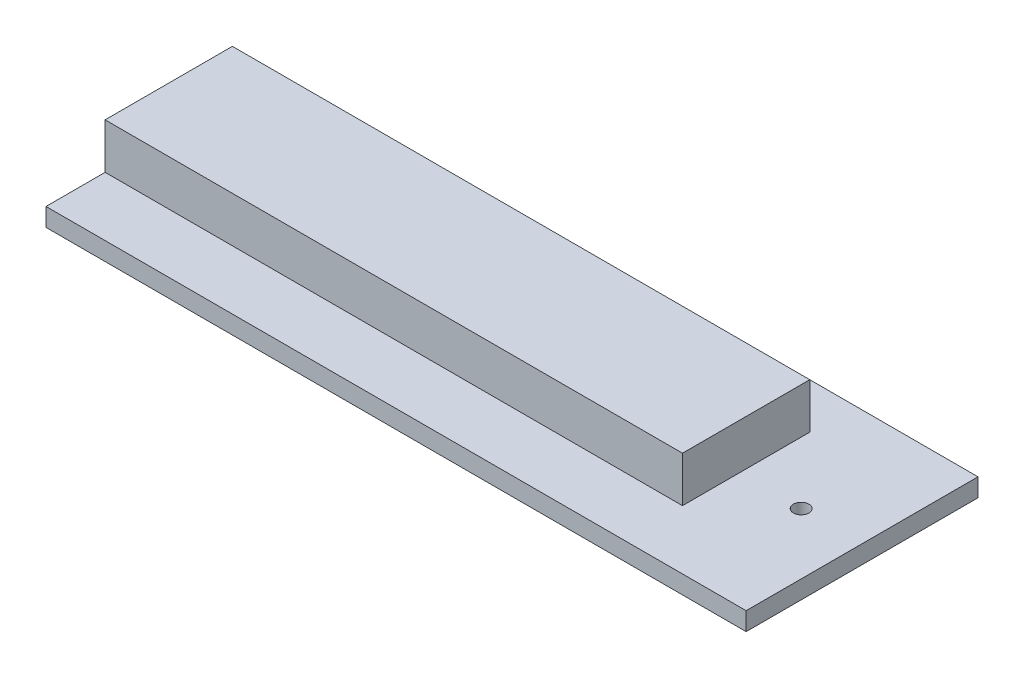
ISO-10303-21;
HEADER;
FILE_DESCRIPTION(('STEP AP214'),'2;1');
FILE_NAME('part.step','',(''),(''),'','','');
FILE_SCHEMA(('AUTOMOTIVE_DESIGN { 1 0 10303 214 1 1 1 1 }'));
ENDSEC;
DATA;
#1=APPLICATION_CONTEXT('core data for automotive mechanical design processes');
#2=APPLICATION_PROTOCOL_DEFINITION('international standard','automotive_design',2000,#1);
#3=PRODUCT_CONTEXT('',#1,'mechanical');
#4=PRODUCT('Part','Part','',(#3));
#5=PRODUCT_RELATED_PRODUCT_CATEGORY('part','',(#4));
#6=PRODUCT_DEFINITION_FORMATION('','',#4);
#7=PRODUCT_DEFINITION_CONTEXT('part definition',#1,'design');
#8=PRODUCT_DEFINITION('design','',#6,#7);
#9=PRODUCT_DEFINITION_SHAPE('','',#8);
#10=(LENGTH_UNIT() NAMED_UNIT(*) SI_UNIT(.MILLI.,.METRE.));
#11=(NAMED_UNIT(*) PLANE_ANGLE_UNIT() SI_UNIT($,.RADIAN.));
#12=(NAMED_UNIT(*) SI_UNIT($,.STERADIAN.) SOLID_ANGLE_UNIT());
#13=UNCERTAINTY_MEASURE_WITH_UNIT(LENGTH_MEASURE(1.E-05),#10,'distance_accuracy_value','');
#14=(GEOMETRIC_REPRESENTATION_CONTEXT(3) GLOBAL_UNCERTAINTY_ASSIGNED_CONTEXT((#13)) GLOBAL_UNIT_ASSIGNED_CONTEXT((#10,
#11,#12)) REPRESENTATION_CONTEXT('',''));
#15=CARTESIAN_POINT('',(0.,0.,0.));
#16=DIRECTION('',(0.,0.,1.));
#17=DIRECTION('',(1.,0.,0.));
#18=AXIS2_PLACEMENT_3D('',#15,#16,#17);
#19=CARTESIAN_POINT('',(0.,4.,0.));
#20=DIRECTION('',(0.,-1.,0.));
#21=DIRECTION('',(0.,0.,-1.));
#22=AXIS2_PLACEMENT_3D('',#19,#20,#21);
#23=PLANE('',#22);
#24=CARTESIAN_POINT('',(140.6,4.,-25.5));
#25=DIRECTION('',(0.,1.,0.));
#26=DIRECTION('',(0.,0.,-1.));
#27=AXIS2_PLACEMENT_3D('',#24,#25,#26);
#28=CIRCLE('',#27,1.70000000000001);
#29=CARTESIAN_POINT('',(140.6,4.,-27.2));
#30=VERTEX_POINT('',#29);
#31=EDGE_CURVE('E145',#30,#30,#28,.T.);
#32=ORIENTED_EDGE('',*,*,#31,.F.);
#33=EDGE_LOOP('',(#32));
#34=FACE_BOUND('',#33,.T.);
#35=DIRECTION('',(-1.,0.,0.));
#36=VECTOR('',#35,1.);
#37=CARTESIAN_POINT('',(127.,4.,-41.));
#38=LINE('',#37,#36);
#39=CARTESIAN_POINT('',(127.,4.,-41.));
#40=VERTEX_POINT('',#39);
#41=CARTESIAN_POINT('',(0.,4.,-41.));
#42=VERTEX_POINT('',#41);
#43=EDGE_CURVE('E59',#40,#42,#38,.T.);
#44=ORIENTED_EDGE('',*,*,#43,.F.);
#45=DIRECTION('',(0.,0.,-1.));
#46=VECTOR('',#45,1.);
#47=CARTESIAN_POINT('',(127.,4.,-13.));
#48=LINE('',#47,#46);
#49=CARTESIAN_POINT('',(127.,4.,-13.));
#50=VERTEX_POINT('',#49);
#51=EDGE_CURVE('E221',#50,#40,#48,.T.);
#52=ORIENTED_EDGE('',*,*,#51,.F.);
#53=DIRECTION('',(1.,0.,0.));
#54=VECTOR('',#53,1.);
#55=CARTESIAN_POINT('',(0.,4.,-13.));
#56=LINE('',#55,#54);
#57=CARTESIAN_POINT('',(0.,4.,-13.));
#58=VERTEX_POINT('',#57);
#59=EDGE_CURVE('E65',#58,#50,#56,.T.);
#60=ORIENTED_EDGE('',*,*,#59,.F.);
#61=DIRECTION('',(0.,0.,1.));
#62=VECTOR('',#61,1.);
#63=CARTESIAN_POINT('',(0.,4.,0.));
#64=LINE('',#63,#62);
#65=CARTESIAN_POINT('',(0.,4.,0.));
#66=VERTEX_POINT('',#65);
#67=EDGE_CURVE('E132',#58,#66,#64,.T.);
#68=ORIENTED_EDGE('',*,*,#67,.T.);
#69=DIRECTION('',(1.,0.,0.));
#70=VECTOR('',#69,1.);
#71=CARTESIAN_POINT('',(0.,4.,0.));
#72=LINE('',#71,#70);
#73=CARTESIAN_POINT('',(154.,4.,0.));
#74=VERTEX_POINT('',#73);
#75=EDGE_CURVE('E168',#66,#74,#72,.T.);
#76=ORIENTED_EDGE('',*,*,#75,.T.);
#77=DIRECTION('',(0.,0.,-1.));
#78=VECTOR('',#77,1.);
#79=CARTESIAN_POINT('',(154.,4.,0.));
#80=LINE('',#79,#78);
#81=CARTESIAN_POINT('',(154.,4.,-51.));
#82=VERTEX_POINT('',#81);
#83=EDGE_CURVE('E171',#74,#82,#80,.T.);
#84=ORIENTED_EDGE('',*,*,#83,.T.);
#85=DIRECTION('',(-1.,0.,0.));
#86=VECTOR('',#85,1.);
#87=CARTESIAN_POINT('',(0.,4.,-51.));
#88=LINE('',#87,#86);
#89=CARTESIAN_POINT('',(0.,4.,-51.));
#90=VERTEX_POINT('',#89);
#91=EDGE_CURVE('E174',#82,#90,#88,.T.);
#92=ORIENTED_EDGE('',*,*,#91,.T.);
#93=EDGE_CURVE('E165',#90,#42,#64,.T.);
#94=ORIENTED_EDGE('',*,*,#93,.T.);
#95=EDGE_LOOP('',(#44,#52,#60,#68,#76,#84,#92,#94));
#96=FACE_BOUND('',#95,.T.);
#97=ADVANCED_FACE('F43',(#34,#96),#23,.F.);
#98=CARTESIAN_POINT('',(0.,0.,0.));
#99=DIRECTION('',(0.,-1.,0.));
#100=DIRECTION('',(0.,0.,-1.));
#101=AXIS2_PLACEMENT_3D('',#98,#99,#100);
#102=PLANE('',#101);
#103=CARTESIAN_POINT('',(13.4,0.,-25.5));
#104=DIRECTION('',(0.,1.,0.));
#105=DIRECTION('',(0.,0.,1.));
#106=AXIS2_PLACEMENT_3D('',#103,#104,#105);
#107=CIRCLE('',#106,1.7);
#108=CARTESIAN_POINT('',(13.4,0.,-23.8));
#109=VERTEX_POINT('',#108);
#110=EDGE_CURVE('E149',#109,#109,#107,.T.);
#111=ORIENTED_EDGE('',*,*,#110,.T.);
#112=EDGE_LOOP('',(#111));
#113=FACE_BOUND('',#112,.T.);
#114=DIRECTION('',(0.,0.,1.));
#115=VECTOR('',#114,1.);
#116=CARTESIAN_POINT('',(0.,0.,0.));
#117=LINE('',#116,#115);
#118=CARTESIAN_POINT('',(0.,0.,-51.));
#119=VERTEX_POINT('',#118);
#120=CARTESIAN_POINT('',(0.,0.,0.));
#121=VERTEX_POINT('',#120);
#122=EDGE_CURVE('E164',#119,#121,#117,.T.);
#123=ORIENTED_EDGE('',*,*,#122,.F.);
#124=DIRECTION('',(-1.,0.,0.));
#125=VECTOR('',#124,1.);
#126=CARTESIAN_POINT('',(0.,0.,-51.));
#127=LINE('',#126,#125);
#128=CARTESIAN_POINT('',(154.,0.,-51.));
#129=VERTEX_POINT('',#128);
#130=EDGE_CURVE('E186',#129,#119,#127,.T.);
#131=ORIENTED_EDGE('',*,*,#130,.F.);
#132=DIRECTION('',(0.,0.,-1.));
#133=VECTOR('',#132,1.);
#134=CARTESIAN_POINT('',(154.,0.,0.));
#135=LINE('',#134,#133);
#136=CARTESIAN_POINT('',(154.,0.,0.));
#137=VERTEX_POINT('',#136);
#138=EDGE_CURVE('E183',#137,#129,#135,.T.);
#139=ORIENTED_EDGE('',*,*,#138,.F.);
#140=DIRECTION('',(1.,0.,0.));
#141=VECTOR('',#140,1.);
#142=CARTESIAN_POINT('',(0.,0.,0.));
#143=LINE('',#142,#141);
#144=EDGE_CURVE('E180',#121,#137,#143,.T.);
#145=ORIENTED_EDGE('',*,*,#144,.F.);
#146=EDGE_LOOP('',(#123,#131,#139,#145));
#147=FACE_BOUND('',#146,.T.);
#148=CARTESIAN_POINT('',(77.,0.,-25.5));
#149=DIRECTION('',(0.,1.,0.));
#150=DIRECTION('',(0.,0.,1.));
#151=AXIS2_PLACEMENT_3D('',#148,#149,#150);
#152=CIRCLE('',#151,1.7);
#153=CARTESIAN_POINT('',(77.,0.,-23.8));
#154=VERTEX_POINT('',#153);
#155=EDGE_CURVE('E157',#154,#154,#152,.T.);
#156=ORIENTED_EDGE('',*,*,#155,.T.);
#157=EDGE_LOOP('',(#156));
#158=FACE_BOUND('',#157,.T.);
#159=CARTESIAN_POINT('',(140.6,0.,-25.5));
#160=DIRECTION('',(0.,1.,0.));
#161=DIRECTION('',(0.,0.,-1.));
#162=AXIS2_PLACEMENT_3D('',#159,#160,#161);
#163=CIRCLE('',#162,1.70000000000001);
#164=CARTESIAN_POINT('',(140.6,0.,-27.2));
#165=VERTEX_POINT('',#164);
#166=EDGE_CURVE('E150',#165,#165,#163,.T.);
#167=ORIENTED_EDGE('',*,*,#166,.T.);
#168=EDGE_LOOP('',(#167));
#169=FACE_BOUND('',#168,.T.);
#170=ADVANCED_FACE('F208',(#113,#147,#158,#169),#102,.T.);
#171=CARTESIAN_POINT('',(0.,4.,0.));
#172=DIRECTION('',(1.,0.,0.));
#173=DIRECTION('',(0.,0.,-1.));
#174=AXIS2_PLACEMENT_3D('',#171,#172,#173);
#175=PLANE('',#174);
#176=ORIENTED_EDGE('',*,*,#122,.T.);
#177=DIRECTION('',(0.,-1.,0.));
#178=VECTOR('',#177,1.);
#179=CARTESIAN_POINT('',(0.,4.,0.));
#180=LINE('',#179,#178);
#181=EDGE_CURVE('E11',#66,#121,#180,.T.);
#182=ORIENTED_EDGE('',*,*,#181,.F.);
#183=ORIENTED_EDGE('',*,*,#67,.F.);
#184=DIRECTION('',(0.,-1.,0.));
#185=VECTOR('',#184,1.);
#186=CARTESIAN_POINT('',(0.,14.,-13.));
#187=LINE('',#186,#185);
#188=CARTESIAN_POINT('',(0.,14.,-13.));
#189=VERTEX_POINT('',#188);
#190=EDGE_CURVE('E112',#189,#58,#187,.T.);
#191=ORIENTED_EDGE('',*,*,#190,.F.);
#192=DIRECTION('',(0.,0.,1.));
#193=VECTOR('',#192,1.);
#194=CARTESIAN_POINT('',(0.,14.,-41.));
#195=LINE('',#194,#193);
#196=CARTESIAN_POINT('',(0.,14.,-41.));
#197=VERTEX_POINT('',#196);
#198=EDGE_CURVE('E119',#197,#189,#195,.T.);
#199=ORIENTED_EDGE('',*,*,#198,.F.);
#200=DIRECTION('',(0.,-1.,0.));
#201=VECTOR('',#200,1.);
#202=CARTESIAN_POINT('',(0.,14.,-41.));
#203=LINE('',#202,#201);
#204=EDGE_CURVE('E215',#197,#42,#203,.T.);
#205=ORIENTED_EDGE('',*,*,#204,.T.);
#206=ORIENTED_EDGE('',*,*,#93,.F.);
#207=DIRECTION('',(0.,-1.,0.));
#208=VECTOR('',#207,1.);
#209=CARTESIAN_POINT('',(0.,4.,-51.));
#210=LINE('',#209,#208);
#211=EDGE_CURVE('E177',#90,#119,#210,.T.);
#212=ORIENTED_EDGE('',*,*,#211,.T.);
#213=EDGE_LOOP('',(#176,#182,#183,#191,#199,#205,#206,#212));
#214=FACE_BOUND('',#213,.T.);
#215=ADVANCED_FACE('F45',(#214),#175,.F.);
#216=CARTESIAN_POINT('',(0.,4.,0.));
#217=DIRECTION('',(0.,0.,-1.));
#218=DIRECTION('',(-1.,0.,0.));
#219=AXIS2_PLACEMENT_3D('',#216,#217,#218);
#220=PLANE('',#219);
#221=ORIENTED_EDGE('',*,*,#144,.T.);
#222=DIRECTION('',(0.,-1.,0.));
#223=VECTOR('',#222,1.);
#224=CARTESIAN_POINT('',(154.,4.,0.));
#225=LINE('',#224,#223);
#226=EDGE_CURVE('E52',#74,#137,#225,.T.);
#227=ORIENTED_EDGE('',*,*,#226,.F.);
#228=ORIENTED_EDGE('',*,*,#75,.F.);
#229=ORIENTED_EDGE('',*,*,#181,.T.);
#230=EDGE_LOOP('',(#221,#227,#228,#229));
#231=FACE_BOUND('',#230,.T.);
#232=ADVANCED_FACE('F261',(#231),#220,.F.);
#233=CARTESIAN_POINT('',(154.,4.,0.));
#234=DIRECTION('',(-1.,0.,0.));
#235=DIRECTION('',(0.,0.,1.));
#236=AXIS2_PLACEMENT_3D('',#233,#234,#235);
#237=PLANE('',#236);
#238=ORIENTED_EDGE('',*,*,#138,.T.);
#239=DIRECTION('',(0.,-1.,0.));
#240=VECTOR('',#239,1.);
#241=CARTESIAN_POINT('',(154.,4.,-51.));
#242=LINE('',#241,#240);
#243=EDGE_CURVE('E192',#82,#129,#242,.T.);
#244=ORIENTED_EDGE('',*,*,#243,.F.);
#245=ORIENTED_EDGE('',*,*,#83,.F.);
#246=ORIENTED_EDGE('',*,*,#226,.T.);
#247=EDGE_LOOP('',(#238,#244,#245,#246));
#248=FACE_BOUND('',#247,.T.);
#249=ADVANCED_FACE('F201',(#248),#237,.F.);
#250=CARTESIAN_POINT('',(0.,4.,-51.));
#251=DIRECTION('',(0.,0.,1.));
#252=DIRECTION('',(1.,0.,0.));
#253=AXIS2_PLACEMENT_3D('',#250,#251,#252);
#254=PLANE('',#253);
#255=ORIENTED_EDGE('',*,*,#130,.T.);
#256=ORIENTED_EDGE('',*,*,#211,.F.);
#257=ORIENTED_EDGE('',*,*,#91,.F.);
#258=ORIENTED_EDGE('',*,*,#243,.T.);
#259=EDGE_LOOP('',(#255,#256,#257,#258));
#260=FACE_BOUND('',#259,.T.);
#261=ADVANCED_FACE('F212',(#260),#254,.F.);
#262=CARTESIAN_POINT('',(77.,4.,-25.5));
#263=DIRECTION('',(0.,-1.,0.));
#264=DIRECTION('',(0.,0.,-1.));
#265=AXIS2_PLACEMENT_3D('',#262,#263,#264);
#266=CYLINDRICAL_SURFACE('',#265,1.7);
#267=CARTESIAN_POINT('',(77.,4.,-25.5));
#268=DIRECTION('',(0.,1.,0.));
#269=DIRECTION('',(0.,0.,1.));
#270=AXIS2_PLACEMENT_3D('',#267,#268,#269);
#271=CIRCLE('',#270,1.7);
#272=CARTESIAN_POINT('',(77.,4.,-23.8));
#273=VERTEX_POINT('',#272);
#274=EDGE_CURVE('E139',#273,#273,#271,.T.);
#275=ORIENTED_EDGE('',*,*,#274,.T.);
#276=EDGE_LOOP('',(#275));
#277=FACE_BOUND('',#276,.T.);
#278=ORIENTED_EDGE('',*,*,#155,.F.);
#279=EDGE_LOOP('',(#278));
#280=FACE_BOUND('',#279,.T.);
#281=ADVANCED_FACE('F255',(#277,#280),#266,.F.);
#282=CARTESIAN_POINT('',(13.4,4.,-25.5));
#283=DIRECTION('',(0.,-1.,0.));
#284=DIRECTION('',(0.,0.,-1.));
#285=AXIS2_PLACEMENT_3D('',#282,#283,#284);
#286=CYLINDRICAL_SURFACE('',#285,1.7);
#287=CARTESIAN_POINT('',(13.4,4.,-25.5));
#288=DIRECTION('',(0.,1.,0.));
#289=DIRECTION('',(0.,0.,1.));
#290=AXIS2_PLACEMENT_3D('',#287,#288,#289);
#291=CIRCLE('',#290,1.7);
#292=CARTESIAN_POINT('',(13.4,4.,-23.8));
#293=VERTEX_POINT('',#292);
#294=EDGE_CURVE('E134',#293,#293,#291,.T.);
#295=ORIENTED_EDGE('',*,*,#294,.T.);
#296=EDGE_LOOP('',(#295));
#297=FACE_BOUND('',#296,.T.);
#298=ORIENTED_EDGE('',*,*,#110,.F.);
#299=EDGE_LOOP('',(#298));
#300=FACE_BOUND('',#299,.T.);
#301=ADVANCED_FACE('F304',(#297,#300),#286,.F.);
#302=CARTESIAN_POINT('',(140.6,4.,-25.5));
#303=DIRECTION('',(0.,-1.,0.));
#304=DIRECTION('',(0.,0.,-1.));
#305=AXIS2_PLACEMENT_3D('',#302,#303,#304);
#306=CYLINDRICAL_SURFACE('',#305,1.70000000000001);
#307=ORIENTED_EDGE('',*,*,#31,.T.);
#308=EDGE_LOOP('',(#307));
#309=FACE_BOUND('',#308,.T.);
#310=ORIENTED_EDGE('',*,*,#166,.F.);
#311=EDGE_LOOP('',(#310));
#312=FACE_BOUND('',#311,.T.);
#313=ADVANCED_FACE('F314',(#309,#312),#306,.F.);
#314=CARTESIAN_POINT('',(0.,14.,0.));
#315=DIRECTION('',(0.,1.,0.));
#316=DIRECTION('',(0.,0.,1.));
#317=AXIS2_PLACEMENT_3D('',#314,#315,#316);
#318=PLANE('',#317);
#319=ORIENTED_EDGE('',*,*,#198,.T.);
#320=DIRECTION('',(1.,0.,0.));
#321=VECTOR('',#320,1.);
#322=CARTESIAN_POINT('',(0.,14.,-13.));
#323=LINE('',#322,#321);
#324=CARTESIAN_POINT('',(127.,14.,-13.));
#325=VERTEX_POINT('',#324);
#326=EDGE_CURVE('E108',#189,#325,#323,.T.);
#327=ORIENTED_EDGE('',*,*,#326,.T.);
#328=DIRECTION('',(0.,0.,-1.));
#329=VECTOR('',#328,1.);
#330=CARTESIAN_POINT('',(127.,14.,-13.));
#331=LINE('',#330,#329);
#332=CARTESIAN_POINT('',(127.,14.,-41.));
#333=VERTEX_POINT('',#332);
#334=EDGE_CURVE('E118',#325,#333,#331,.T.);
#335=ORIENTED_EDGE('',*,*,#334,.T.);
#336=DIRECTION('',(-1.,0.,0.));
#337=VECTOR('',#336,1.);
#338=CARTESIAN_POINT('',(127.,14.,-41.));
#339=LINE('',#338,#337);
#340=EDGE_CURVE('E124',#333,#197,#339,.T.);
#341=ORIENTED_EDGE('',*,*,#340,.T.);
#342=EDGE_LOOP('',(#319,#327,#335,#341));
#343=FACE_BOUND('',#342,.T.);
#344=ADVANCED_FACE('F122',(#343),#318,.T.);
#345=CARTESIAN_POINT('',(127.,14.,-41.));
#346=DIRECTION('',(0.,0.,1.));
#347=DIRECTION('',(1.,0.,0.));
#348=AXIS2_PLACEMENT_3D('',#345,#346,#347);
#349=PLANE('',#348);
#350=ORIENTED_EDGE('',*,*,#43,.T.);
#351=ORIENTED_EDGE('',*,*,#204,.F.);
#352=ORIENTED_EDGE('',*,*,#340,.F.);
#353=DIRECTION('',(0.,-1.,0.));
#354=VECTOR('',#353,1.);
#355=CARTESIAN_POINT('',(127.,14.,-41.));
#356=LINE('',#355,#354);
#357=EDGE_CURVE('E141',#333,#40,#356,.T.);
#358=ORIENTED_EDGE('',*,*,#357,.T.);
#359=EDGE_LOOP('',(#350,#351,#352,#358));
#360=FACE_BOUND('',#359,.T.);
#361=ADVANCED_FACE('F218',(#360),#349,.F.);
#362=CARTESIAN_POINT('',(127.,14.,-13.));
#363=DIRECTION('',(-1.,0.,0.));
#364=DIRECTION('',(0.,0.,1.));
#365=AXIS2_PLACEMENT_3D('',#362,#363,#364);
#366=PLANE('',#365);
#367=ORIENTED_EDGE('',*,*,#51,.T.);
#368=ORIENTED_EDGE('',*,*,#357,.F.);
#369=ORIENTED_EDGE('',*,*,#334,.F.);
#370=DIRECTION('',(0.,-1.,0.));
#371=VECTOR('',#370,1.);
#372=CARTESIAN_POINT('',(127.,14.,-13.));
#373=LINE('',#372,#371);
#374=EDGE_CURVE('E114',#325,#50,#373,.T.);
#375=ORIENTED_EDGE('',*,*,#374,.T.);
#376=EDGE_LOOP('',(#367,#368,#369,#375));
#377=FACE_BOUND('',#376,.T.);
#378=ADVANCED_FACE('F235',(#377),#366,.F.);
#379=CARTESIAN_POINT('',(0.,14.,-13.));
#380=DIRECTION('',(0.,0.,-1.));
#381=DIRECTION('',(-1.,0.,0.));
#382=AXIS2_PLACEMENT_3D('',#379,#380,#381);
#383=PLANE('',#382);
#384=ORIENTED_EDGE('',*,*,#59,.T.);
#385=ORIENTED_EDGE('',*,*,#374,.F.);
#386=ORIENTED_EDGE('',*,*,#326,.F.);
#387=ORIENTED_EDGE('',*,*,#190,.T.);
#388=EDGE_LOOP('',(#384,#385,#386,#387));
#389=FACE_BOUND('',#388,.T.);
#390=ADVANCED_FACE('F110',(#389),#383,.F.);
#391=CARTESIAN_POINT('',(0.,4.,0.));
#392=DIRECTION('',(0.,1.,0.));
#393=DIRECTION('',(0.,0.,1.));
#394=AXIS2_PLACEMENT_3D('',#391,#392,#393);
#395=PLANE('',#394);
#396=ORIENTED_EDGE('',*,*,#294,.F.);
#397=EDGE_LOOP('',(#396));
#398=FACE_BOUND('',#397,.T.);
#399=ADVANCED_FACE('F242',(#398),#395,.F.);
#400=ORIENTED_EDGE('',*,*,#274,.F.);
#401=EDGE_LOOP('',(#400));
#402=FACE_BOUND('',#401,.T.);
#403=ADVANCED_FACE('F365',(#402),#395,.F.);
#404=CLOSED_SHELL('',(#97,#170,#215,#232,#249,#261,#281,#301,#313,#344,#361,#378,#390,#399,#403));
#405=MANIFOLD_SOLID_BREP('B2',#404);
#406=ADVANCED_BREP_SHAPE_REPRESENTATION('',(#18,#405),#14);
#407=SHAPE_DEFINITION_REPRESENTATION(#9,#406);
ENDSEC;
END-ISO-10303-21;
